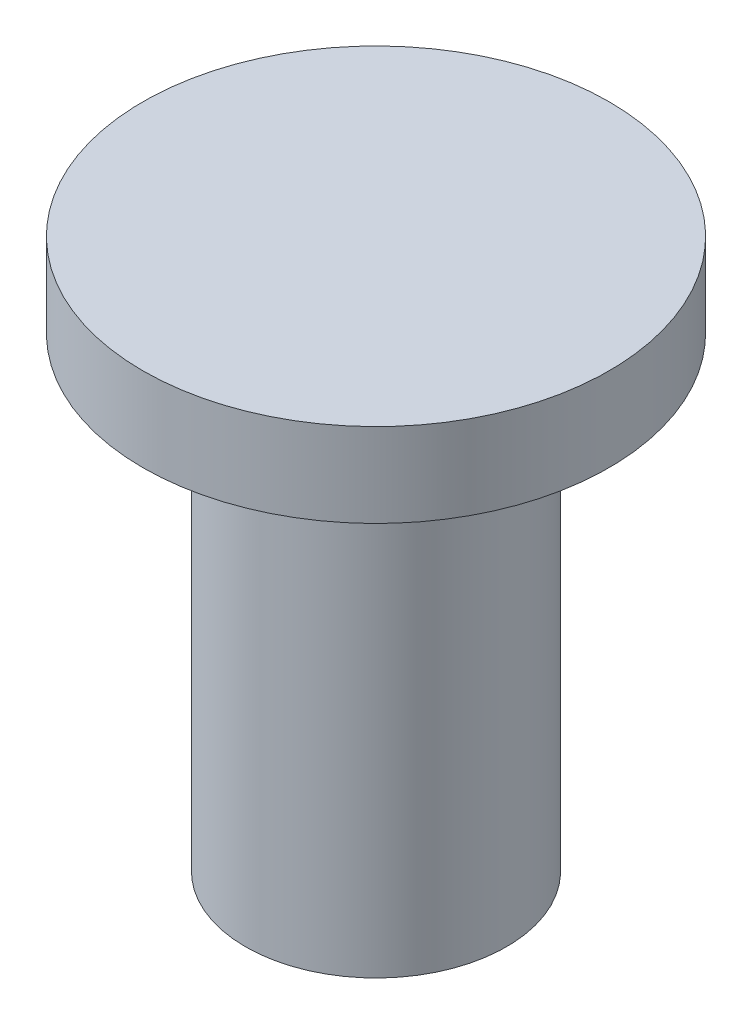
ISO-10303-21;
HEADER;
FILE_DESCRIPTION(('STEP AP214'),'2;1');
FILE_NAME('part.step','',(''),(''),'','','');
FILE_SCHEMA(('AUTOMOTIVE_DESIGN { 1 0 10303 214 1 1 1 1 }'));
ENDSEC;
DATA;
#1=APPLICATION_CONTEXT('core data for automotive mechanical design processes');
#2=APPLICATION_PROTOCOL_DEFINITION('international standard','automotive_design',2000,#1);
#3=PRODUCT_CONTEXT('',#1,'mechanical');
#4=PRODUCT('Part','Part','',(#3));
#5=PRODUCT_RELATED_PRODUCT_CATEGORY('part','',(#4));
#6=PRODUCT_DEFINITION_FORMATION('','',#4);
#7=PRODUCT_DEFINITION_CONTEXT('part definition',#1,'design');
#8=PRODUCT_DEFINITION('design','',#6,#7);
#9=PRODUCT_DEFINITION_SHAPE('','',#8);
#10=(LENGTH_UNIT() NAMED_UNIT(*) SI_UNIT(.MILLI.,.METRE.));
#11=(NAMED_UNIT(*) PLANE_ANGLE_UNIT() SI_UNIT($,.RADIAN.));
#12=(NAMED_UNIT(*) SI_UNIT($,.STERADIAN.) SOLID_ANGLE_UNIT());
#13=UNCERTAINTY_MEASURE_WITH_UNIT(LENGTH_MEASURE(1.E-05),#10,'distance_accuracy_value','');
#14=(GEOMETRIC_REPRESENTATION_CONTEXT(3) GLOBAL_UNCERTAINTY_ASSIGNED_CONTEXT((#13)) GLOBAL_UNIT_ASSIGNED_CONTEXT((#10,
#11,#12)) REPRESENTATION_CONTEXT('',''));
#15=CARTESIAN_POINT('',(0.,0.,0.));
#16=DIRECTION('',(0.,0.,1.));
#17=DIRECTION('',(1.,0.,0.));
#18=AXIS2_PLACEMENT_3D('',#15,#16,#17);
#19=CARTESIAN_POINT('',(0.,2.5,0.));
#20=DIRECTION('',(0.,-1.,0.));
#21=DIRECTION('',(0.,0.,-1.));
#22=AXIS2_PLACEMENT_3D('',#19,#20,#21);
#23=CYLINDRICAL_SURFACE('',#22,1.4);
#24=CARTESIAN_POINT('',(0.,2.5,0.));
#25=DIRECTION('',(0.,1.,0.));
#26=DIRECTION('',(0.,0.,1.));
#27=AXIS2_PLACEMENT_3D('',#24,#25,#26);
#28=CIRCLE('',#27,1.4);
#29=CARTESIAN_POINT('',(0.,2.5,1.4));
#30=VERTEX_POINT('',#29);
#31=EDGE_CURVE('E10',#30,#30,#28,.T.);
#32=ORIENTED_EDGE('',*,*,#31,.F.);
#33=EDGE_LOOP('',(#32));
#34=FACE_BOUND('',#33,.T.);
#35=CARTESIAN_POINT('',(0.,-2.5,0.));
#36=DIRECTION('',(0.,1.,0.));
#37=DIRECTION('',(0.,0.,1.));
#38=AXIS2_PLACEMENT_3D('',#35,#36,#37);
#39=CIRCLE('',#38,1.4);
#40=CARTESIAN_POINT('',(0.,-2.5,1.4));
#41=VERTEX_POINT('',#40);
#42=EDGE_CURVE('E34',#41,#41,#39,.T.);
#43=ORIENTED_EDGE('',*,*,#42,.T.);
#44=EDGE_LOOP('',(#43));
#45=FACE_BOUND('',#44,.T.);
#46=ADVANCED_FACE('F31',(#34,#45),#23,.T.);
#47=CARTESIAN_POINT('',(0.,-2.5,0.));
#48=DIRECTION('',(0.,1.,0.));
#49=DIRECTION('',(0.,0.,1.));
#50=AXIS2_PLACEMENT_3D('',#47,#48,#49);
#51=PLANE('',#50);
#52=ORIENTED_EDGE('',*,*,#42,.F.);
#53=EDGE_LOOP('',(#52));
#54=FACE_BOUND('',#53,.T.);
#55=ADVANCED_FACE('F54',(#54),#51,.F.);
#56=CARTESIAN_POINT('',(0.,3.4,0.));
#57=DIRECTION('',(0.,-1.,0.));
#58=DIRECTION('',(0.,0.,-1.));
#59=AXIS2_PLACEMENT_3D('',#56,#57,#58);
#60=CYLINDRICAL_SURFACE('',#59,2.5);
#61=CARTESIAN_POINT('',(0.,3.4,0.));
#62=DIRECTION('',(0.,1.,0.));
#63=DIRECTION('',(0.,0.,1.));
#64=AXIS2_PLACEMENT_3D('',#61,#62,#63);
#65=CIRCLE('',#64,2.5);
#66=CARTESIAN_POINT('',(0.,3.4,2.5));
#67=VERTEX_POINT('',#66);
#68=EDGE_CURVE('E41',#67,#67,#65,.T.);
#69=ORIENTED_EDGE('',*,*,#68,.F.);
#70=EDGE_LOOP('',(#69));
#71=FACE_BOUND('',#70,.T.);
#72=CARTESIAN_POINT('',(0.,2.5,0.));
#73=DIRECTION('',(0.,1.,0.));
#74=DIRECTION('',(0.,0.,1.));
#75=AXIS2_PLACEMENT_3D('',#72,#73,#74);
#76=CIRCLE('',#75,2.5);
#77=CARTESIAN_POINT('',(0.,2.5,2.5));
#78=VERTEX_POINT('',#77);
#79=EDGE_CURVE('E43',#78,#78,#76,.T.);
#80=ORIENTED_EDGE('',*,*,#79,.T.);
#81=EDGE_LOOP('',(#80));
#82=FACE_BOUND('',#81,.T.);
#83=ADVANCED_FACE('F51',(#71,#82),#60,.T.);
#84=CARTESIAN_POINT('',(0.,3.4,0.));
#85=DIRECTION('',(0.,1.,0.));
#86=DIRECTION('',(0.,0.,1.));
#87=AXIS2_PLACEMENT_3D('',#84,#85,#86);
#88=PLANE('',#87);
#89=ORIENTED_EDGE('',*,*,#68,.T.);
#90=EDGE_LOOP('',(#89));
#91=FACE_BOUND('',#90,.T.);
#92=ADVANCED_FACE('F49',(#91),#88,.T.);
#93=CARTESIAN_POINT('',(0.,2.5,0.));
#94=DIRECTION('',(0.,1.,0.));
#95=DIRECTION('',(0.,0.,1.));
#96=AXIS2_PLACEMENT_3D('',#93,#94,#95);
#97=PLANE('',#96);
#98=ORIENTED_EDGE('',*,*,#31,.T.);
#99=EDGE_LOOP('',(#98));
#100=FACE_BOUND('',#99,.T.);
#101=ORIENTED_EDGE('',*,*,#79,.F.);
#102=EDGE_LOOP('',(#101));
#103=FACE_BOUND('',#102,.T.);
#104=ADVANCED_FACE('F58',(#100,#103),#97,.F.);
#105=CLOSED_SHELL('',(#46,#55,#83,#92,#104));
#106=MANIFOLD_SOLID_BREP('B2',#105);
#107=ADVANCED_BREP_SHAPE_REPRESENTATION('',(#18,#106),#14);
#108=SHAPE_DEFINITION_REPRESENTATION(#9,#107);
ENDSEC;
END-ISO-10303-21;
